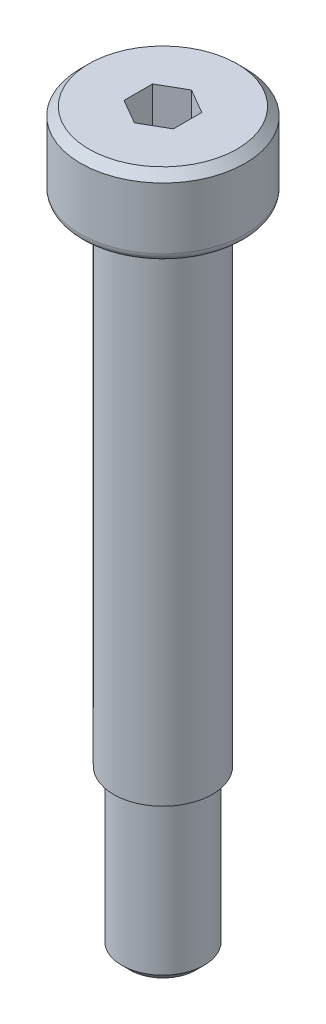
ISO-10303-21;
HEADER;
FILE_DESCRIPTION(('STEP AP214'),'2;1');
FILE_NAME('part.step','',(''),(''),'','','');
FILE_SCHEMA(('AUTOMOTIVE_DESIGN { 1 0 10303 214 1 1 1 1 }'));
ENDSEC;
DATA;
#1=APPLICATION_CONTEXT('core data for automotive mechanical design processes');
#2=APPLICATION_PROTOCOL_DEFINITION('international standard','automotive_design',2000,#1);
#3=PRODUCT_CONTEXT('',#1,'mechanical');
#4=PRODUCT('Part','Part','',(#3));
#5=PRODUCT_RELATED_PRODUCT_CATEGORY('part','',(#4));
#6=PRODUCT_DEFINITION_FORMATION('','',#4);
#7=PRODUCT_DEFINITION_CONTEXT('part definition',#1,'design');
#8=PRODUCT_DEFINITION('design','',#6,#7);
#9=PRODUCT_DEFINITION_SHAPE('','',#8);
#10=(LENGTH_UNIT() NAMED_UNIT(*) SI_UNIT(.MILLI.,.METRE.));
#11=(NAMED_UNIT(*) PLANE_ANGLE_UNIT() SI_UNIT($,.RADIAN.));
#12=(NAMED_UNIT(*) SI_UNIT($,.STERADIAN.) SOLID_ANGLE_UNIT());
#13=UNCERTAINTY_MEASURE_WITH_UNIT(LENGTH_MEASURE(1.E-05),#10,'distance_accuracy_value','');
#14=(GEOMETRIC_REPRESENTATION_CONTEXT(3) GLOBAL_UNCERTAINTY_ASSIGNED_CONTEXT((#13)) GLOBAL_UNIT_ASSIGNED_CONTEXT((#10,
#11,#12)) REPRESENTATION_CONTEXT('',''));
#15=CARTESIAN_POINT('',(0.,0.,0.));
#16=DIRECTION('',(0.,0.,1.));
#17=DIRECTION('',(1.,0.,0.));
#18=AXIS2_PLACEMENT_3D('',#15,#16,#17);
#19=CARTESIAN_POINT('',(0.,0.,0.));
#20=DIRECTION('',(0.,-1.,0.));
#21=DIRECTION('',(1.,0.,0.));
#22=AXIS2_PLACEMENT_3D('',#19,#20,#21);
#23=PLANE('',#22);
#24=CARTESIAN_POINT('',(0.,0.,0.));
#25=DIRECTION('',(0.,-1.,0.));
#26=DIRECTION('',(1.,0.,0.));
#27=AXIS2_PLACEMENT_3D('',#24,#25,#26);
#28=CIRCLE('',#27,4.49999999999999);
#29=CARTESIAN_POINT('',(4.49999999999999,0.,0.));
#30=VERTEX_POINT('',#29);
#31=EDGE_CURVE('E191',#30,#30,#28,.F.);
#32=ORIENTED_EDGE('',*,*,#31,.T.);
#33=EDGE_LOOP('',(#32));
#34=FACE_BOUND('',#33,.T.);
#35=DIRECTION('',(0.866025403784438,0.,-0.5));
#36=VECTOR('',#35,1.);
#37=CARTESIAN_POINT('',(0.,0.,1.73205080756888));
#38=LINE('',#37,#36);
#39=CARTESIAN_POINT('',(0.,0.,1.73205080756888));
#40=VERTEX_POINT('',#39);
#41=CARTESIAN_POINT('',(1.5,0.,0.866025403784439));
#42=VERTEX_POINT('',#41);
#43=EDGE_CURVE('E143',#40,#42,#38,.T.);
#44=ORIENTED_EDGE('',*,*,#43,.F.);
#45=DIRECTION('',(0.866025403784438,0.,0.5));
#46=VECTOR('',#45,1.);
#47=CARTESIAN_POINT('',(-1.5,0.,0.866025403784439));
#48=LINE('',#47,#46);
#49=CARTESIAN_POINT('',(-1.5,0.,0.866025403784439));
#50=VERTEX_POINT('',#49);
#51=EDGE_CURVE('E62',#50,#40,#48,.T.);
#52=ORIENTED_EDGE('',*,*,#51,.F.);
#53=DIRECTION('',(0.,0.,1.));
#54=VECTOR('',#53,1.);
#55=CARTESIAN_POINT('',(-1.5,0.,-0.866025403784439));
#56=LINE('',#55,#54);
#57=CARTESIAN_POINT('',(-1.5,0.,-0.866025403784439));
#58=VERTEX_POINT('',#57);
#59=EDGE_CURVE('E156',#58,#50,#56,.T.);
#60=ORIENTED_EDGE('',*,*,#59,.F.);
#61=DIRECTION('',(-0.866025403784439,0.,0.5));
#62=VECTOR('',#61,1.);
#63=CARTESIAN_POINT('',(0.,0.,-1.73205080756888));
#64=LINE('',#63,#62);
#65=CARTESIAN_POINT('',(0.,0.,-1.73205080756888));
#66=VERTEX_POINT('',#65);
#67=EDGE_CURVE('E153',#66,#58,#64,.T.);
#68=ORIENTED_EDGE('',*,*,#67,.F.);
#69=DIRECTION('',(-0.866025403784439,0.,-0.5));
#70=VECTOR('',#69,1.);
#71=CARTESIAN_POINT('',(1.5,0.,-0.86602540378444));
#72=LINE('',#71,#70);
#73=CARTESIAN_POINT('',(1.5,0.,-0.86602540378444));
#74=VERTEX_POINT('',#73);
#75=EDGE_CURVE('E110',#74,#66,#72,.T.);
#76=ORIENTED_EDGE('',*,*,#75,.F.);
#77=DIRECTION('',(0.,0.,-1.));
#78=VECTOR('',#77,1.);
#79=CARTESIAN_POINT('',(1.5,0.,0.866025403784439));
#80=LINE('',#79,#78);
#81=EDGE_CURVE('E147',#42,#74,#80,.T.);
#82=ORIENTED_EDGE('',*,*,#81,.F.);
#83=EDGE_LOOP('',(#44,#52,#60,#68,#76,#82));
#84=FACE_BOUND('',#83,.T.);
#85=ADVANCED_FACE('F45',(#34,#84),#23,.F.);
#86=CARTESIAN_POINT('',(0.,5.,0.));
#87=DIRECTION('',(0.,1.,0.));
#88=DIRECTION('',(-1.,0.,0.));
#89=AXIS2_PLACEMENT_3D('',#86,#87,#88);
#90=CYLINDRICAL_SURFACE('',#89,5.);
#91=CARTESIAN_POINT('',(0.,-4.23,0.));
#92=DIRECTION('',(0.,1.,0.));
#93=DIRECTION('',(-1.,0.,0.));
#94=AXIS2_PLACEMENT_3D('',#91,#92,#93);
#95=CIRCLE('',#94,5.);
#96=CARTESIAN_POINT('',(-5.,-4.23,0.));
#97=VERTEX_POINT('',#96);
#98=EDGE_CURVE('E199',#97,#97,#95,.T.);
#99=ORIENTED_EDGE('',*,*,#98,.T.);
#100=EDGE_LOOP('',(#99));
#101=FACE_BOUND('',#100,.T.);
#102=CARTESIAN_POINT('',(0.,-0.500000000000005,0.));
#103=DIRECTION('',(0.,-1.,0.));
#104=DIRECTION('',(1.,0.,0.));
#105=AXIS2_PLACEMENT_3D('',#102,#103,#104);
#106=CIRCLE('',#105,5.);
#107=CARTESIAN_POINT('',(5.,-0.500000000000004,0.));
#108=VERTEX_POINT('',#107);
#109=EDGE_CURVE('E195',#108,#108,#106,.T.);
#110=ORIENTED_EDGE('',*,*,#109,.T.);
#111=EDGE_LOOP('',(#110));
#112=FACE_BOUND('',#111,.T.);
#113=ADVANCED_FACE('F225',(#101,#112),#90,.T.);
#114=CARTESIAN_POINT('',(5.,-4.73,0.));
#115=DIRECTION('',(0.,1.,0.));
#116=DIRECTION('',(-1.,0.,0.));
#117=AXIS2_PLACEMENT_3D('',#114,#115,#116);
#118=PLANE('',#117);
#119=CARTESIAN_POINT('',(0.,-4.73,0.));
#120=DIRECTION('',(0.,1.,0.));
#121=DIRECTION('',(-1.,0.,0.));
#122=AXIS2_PLACEMENT_3D('',#119,#120,#121);
#123=CIRCLE('',#122,4.5);
#124=CARTESIAN_POINT('',(-4.5,-4.73,0.));
#125=VERTEX_POINT('',#124);
#126=EDGE_CURVE('E203',#125,#125,#123,.F.);
#127=ORIENTED_EDGE('',*,*,#126,.T.);
#128=EDGE_LOOP('',(#127));
#129=FACE_BOUND('',#128,.T.);
#130=CARTESIAN_POINT('',(0.,-4.73,0.));
#131=DIRECTION('',(0.,1.,0.));
#132=DIRECTION('',(-1.,0.,0.));
#133=AXIS2_PLACEMENT_3D('',#130,#131,#132);
#134=CIRCLE('',#133,2.75);
#135=CARTESIAN_POINT('',(-2.75,-4.73,0.));
#136=VERTEX_POINT('',#135);
#137=EDGE_CURVE('E187',#136,#136,#134,.T.);
#138=ORIENTED_EDGE('',*,*,#137,.T.);
#139=EDGE_LOOP('',(#138));
#140=FACE_BOUND('',#139,.T.);
#141=ADVANCED_FACE('F233',(#129,#140),#118,.F.);
#142=CARTESIAN_POINT('',(0.,5.,0.));
#143=DIRECTION('',(0.,1.,0.));
#144=DIRECTION('',(-1.,0.,0.));
#145=AXIS2_PLACEMENT_3D('',#142,#143,#144);
#146=CYLINDRICAL_SURFACE('',#145,2.75);
#147=ORIENTED_EDGE('',*,*,#137,.F.);
#148=EDGE_LOOP('',(#147));
#149=FACE_BOUND('',#148,.T.);
#150=CARTESIAN_POINT('',(0.,-5.23,0.));
#151=DIRECTION('',(0.,1.,0.));
#152=DIRECTION('',(-1.,0.,0.));
#153=AXIS2_PLACEMENT_3D('',#150,#151,#152);
#154=CIRCLE('',#153,2.75);
#155=CARTESIAN_POINT('',(-2.75,-5.23,0.));
#156=VERTEX_POINT('',#155);
#157=EDGE_CURVE('E183',#156,#156,#154,.T.);
#158=ORIENTED_EDGE('',*,*,#157,.T.);
#159=EDGE_LOOP('',(#158));
#160=FACE_BOUND('',#159,.T.);
#161=ADVANCED_FACE('F287',(#149,#160),#146,.T.);
#162=CARTESIAN_POINT('',(2.75,-5.23,0.));
#163=DIRECTION('',(0.,-1.,0.));
#164=DIRECTION('',(1.,0.,0.));
#165=AXIS2_PLACEMENT_3D('',#162,#163,#164);
#166=PLANE('',#165);
#167=ORIENTED_EDGE('',*,*,#157,.F.);
#168=EDGE_LOOP('',(#167));
#169=FACE_BOUND('',#168,.T.);
#170=CARTESIAN_POINT('',(0.,-5.23,0.));
#171=DIRECTION('',(0.,1.,0.));
#172=DIRECTION('',(-1.,0.,0.));
#173=AXIS2_PLACEMENT_3D('',#170,#171,#172);
#174=CIRCLE('',#173,3.);
#175=CARTESIAN_POINT('',(-3.,-5.23,0.));
#176=VERTEX_POINT('',#175);
#177=EDGE_CURVE('E179',#176,#176,#174,.T.);
#178=ORIENTED_EDGE('',*,*,#177,.T.);
#179=EDGE_LOOP('',(#178));
#180=FACE_BOUND('',#179,.T.);
#181=ADVANCED_FACE('F283',(#169,#180),#166,.F.);
#182=CARTESIAN_POINT('',(0.,5.,0.));
#183=DIRECTION('',(0.,1.,0.));
#184=DIRECTION('',(-1.,0.,0.));
#185=AXIS2_PLACEMENT_3D('',#182,#183,#184);
#186=CYLINDRICAL_SURFACE('',#185,3.);
#187=ORIENTED_EDGE('',*,*,#177,.F.);
#188=EDGE_LOOP('',(#187));
#189=FACE_BOUND('',#188,.T.);
#190=CARTESIAN_POINT('',(0.,-34.73,0.));
#191=DIRECTION('',(0.,1.,0.));
#192=DIRECTION('',(-1.,0.,0.));
#193=AXIS2_PLACEMENT_3D('',#190,#191,#192);
#194=CIRCLE('',#193,3.00000000000001);
#195=CARTESIAN_POINT('',(-3.,-34.73,0.));
#196=VERTEX_POINT('',#195);
#197=EDGE_CURVE('E175',#196,#196,#194,.T.);
#198=ORIENTED_EDGE('',*,*,#197,.T.);
#199=EDGE_LOOP('',(#198));
#200=FACE_BOUND('',#199,.T.);
#201=ADVANCED_FACE('F279',(#189,#200),#186,.T.);
#202=CARTESIAN_POINT('',(3.00000000000001,-34.73,0.));
#203=DIRECTION('',(0.,1.,0.));
#204=DIRECTION('',(-1.,0.,0.));
#205=AXIS2_PLACEMENT_3D('',#202,#203,#204);
#206=PLANE('',#205);
#207=ORIENTED_EDGE('',*,*,#197,.F.);
#208=EDGE_LOOP('',(#207));
#209=FACE_BOUND('',#208,.T.);
#210=CARTESIAN_POINT('',(0.,-34.73,0.));
#211=DIRECTION('',(0.,1.,0.));
#212=DIRECTION('',(-1.,0.,0.));
#213=AXIS2_PLACEMENT_3D('',#210,#211,#212);
#214=CIRCLE('',#213,2.5);
#215=CARTESIAN_POINT('',(-2.49999999999999,-34.73,0.));
#216=VERTEX_POINT('',#215);
#217=EDGE_CURVE('E162',#216,#216,#214,.T.);
#218=ORIENTED_EDGE('',*,*,#217,.T.);
#219=EDGE_LOOP('',(#218));
#220=FACE_BOUND('',#219,.T.);
#221=ADVANCED_FACE('F276',(#209,#220),#206,.F.);
#222=CARTESIAN_POINT('',(0.,5.,0.));
#223=DIRECTION('',(0.,1.,0.));
#224=DIRECTION('',(-1.,0.,0.));
#225=AXIS2_PLACEMENT_3D('',#222,#223,#224);
#226=CYLINDRICAL_SURFACE('',#225,2.5);
#227=CARTESIAN_POINT('',(0.,-43.98,0.));
#228=DIRECTION('',(0.,1.,0.));
#229=DIRECTION('',(-1.,0.,0.));
#230=AXIS2_PLACEMENT_3D('',#227,#228,#229);
#231=CIRCLE('',#230,2.5);
#232=CARTESIAN_POINT('',(-2.49999999999999,-43.98,0.));
#233=VERTEX_POINT('',#232);
#234=EDGE_CURVE('E55',#233,#233,#231,.T.);
#235=ORIENTED_EDGE('',*,*,#234,.T.);
#236=EDGE_LOOP('',(#235));
#237=FACE_BOUND('',#236,.T.);
#238=ORIENTED_EDGE('',*,*,#217,.F.);
#239=EDGE_LOOP('',(#238));
#240=FACE_BOUND('',#239,.T.);
#241=ADVANCED_FACE('F211',(#237,#240),#226,.T.);
#242=CARTESIAN_POINT('',(2.50000000000001,-44.48,0.));
#243=DIRECTION('',(0.,1.,0.));
#244=DIRECTION('',(-1.,0.,0.));
#245=AXIS2_PLACEMENT_3D('',#242,#243,#244);
#246=PLANE('',#245);
#247=CARTESIAN_POINT('',(0.,-44.48,0.));
#248=DIRECTION('',(0.,1.,0.));
#249=DIRECTION('',(-1.,0.,0.));
#250=AXIS2_PLACEMENT_3D('',#247,#248,#249);
#251=CIRCLE('',#250,1.99999999999999);
#252=CARTESIAN_POINT('',(-1.99999999999998,-44.48,0.));
#253=VERTEX_POINT('',#252);
#254=EDGE_CURVE('E11',#253,#253,#251,.F.);
#255=ORIENTED_EDGE('',*,*,#254,.T.);
#256=EDGE_LOOP('',(#255));
#257=FACE_BOUND('',#256,.T.);
#258=ADVANCED_FACE('F271',(#257),#246,.F.);
#259=CARTESIAN_POINT('',(-1.5,-2.4,0.866025403784439));
#260=DIRECTION('',(-0.5,0.,0.866025403784439));
#261=DIRECTION('',(0.866025403784439,0.,0.5));
#262=AXIS2_PLACEMENT_3D('',#259,#260,#261);
#263=PLANE('',#262);
#264=ORIENTED_EDGE('',*,*,#51,.T.);
#265=DIRECTION('',(0.,1.,0.));
#266=VECTOR('',#265,1.);
#267=CARTESIAN_POINT('',(0.,-2.4,1.73205080756888));
#268=LINE('',#267,#266);
#269=CARTESIAN_POINT('',(0.,-2.4,1.73205080756888));
#270=VERTEX_POINT('',#269);
#271=EDGE_CURVE('E92',#270,#40,#268,.T.);
#272=ORIENTED_EDGE('',*,*,#271,.F.);
#273=DIRECTION('',(0.866025403784438,0.,0.5));
#274=VECTOR('',#273,1.);
#275=CARTESIAN_POINT('',(-1.5,-2.4,0.866025403784439));
#276=LINE('',#275,#274);
#277=CARTESIAN_POINT('',(-1.5,-2.4,0.866025403784439));
#278=VERTEX_POINT('',#277);
#279=EDGE_CURVE('E159',#278,#270,#276,.T.);
#280=ORIENTED_EDGE('',*,*,#279,.F.);
#281=DIRECTION('',(0.,1.,0.));
#282=VECTOR('',#281,1.);
#283=CARTESIAN_POINT('',(-1.5,-2.4,0.866025403784439));
#284=LINE('',#283,#282);
#285=EDGE_CURVE('E70',#278,#50,#284,.T.);
#286=ORIENTED_EDGE('',*,*,#285,.T.);
#287=EDGE_LOOP('',(#264,#272,#280,#286));
#288=FACE_BOUND('',#287,.T.);
#289=ADVANCED_FACE('F261',(#288),#263,.F.);
#290=CARTESIAN_POINT('',(-1.5,-2.4,-0.866025403784439));
#291=DIRECTION('',(-1.,0.,0.));
#292=DIRECTION('',(0.,0.,1.));
#293=AXIS2_PLACEMENT_3D('',#290,#291,#292);
#294=PLANE('',#293);
#295=ORIENTED_EDGE('',*,*,#59,.T.);
#296=ORIENTED_EDGE('',*,*,#285,.F.);
#297=DIRECTION('',(0.,0.,1.));
#298=VECTOR('',#297,1.);
#299=CARTESIAN_POINT('',(-1.5,-2.4,-0.866025403784439));
#300=LINE('',#299,#298);
#301=CARTESIAN_POINT('',(-1.5,-2.4,-0.866025403784439));
#302=VERTEX_POINT('',#301);
#303=EDGE_CURVE('E124',#302,#278,#300,.T.);
#304=ORIENTED_EDGE('',*,*,#303,.F.);
#305=DIRECTION('',(0.,1.,0.));
#306=VECTOR('',#305,1.);
#307=CARTESIAN_POINT('',(-1.5,-2.4,-0.866025403784439));
#308=LINE('',#307,#306);
#309=EDGE_CURVE('E115',#302,#58,#308,.T.);
#310=ORIENTED_EDGE('',*,*,#309,.T.);
#311=EDGE_LOOP('',(#295,#296,#304,#310));
#312=FACE_BOUND('',#311,.T.);
#313=ADVANCED_FACE('F258',(#312),#294,.F.);
#314=CARTESIAN_POINT('',(0.,-2.4,-1.73205080756888));
#315=DIRECTION('',(-0.5,0.,-0.866025403784439));
#316=DIRECTION('',(-0.866025403784439,0.,0.5));
#317=AXIS2_PLACEMENT_3D('',#314,#315,#316);
#318=PLANE('',#317);
#319=ORIENTED_EDGE('',*,*,#67,.T.);
#320=ORIENTED_EDGE('',*,*,#309,.F.);
#321=DIRECTION('',(-0.866025403784439,0.,0.5));
#322=VECTOR('',#321,1.);
#323=CARTESIAN_POINT('',(0.,-2.4,-1.73205080756888));
#324=LINE('',#323,#322);
#325=CARTESIAN_POINT('',(0.,-2.4,-1.73205080756888));
#326=VERTEX_POINT('',#325);
#327=EDGE_CURVE('E119',#326,#302,#324,.T.);
#328=ORIENTED_EDGE('',*,*,#327,.F.);
#329=DIRECTION('',(0.,1.,0.));
#330=VECTOR('',#329,1.);
#331=CARTESIAN_POINT('',(0.,-2.4,-1.73205080756888));
#332=LINE('',#331,#330);
#333=EDGE_CURVE('E103',#326,#66,#332,.T.);
#334=ORIENTED_EDGE('',*,*,#333,.T.);
#335=EDGE_LOOP('',(#319,#320,#328,#334));
#336=FACE_BOUND('',#335,.T.);
#337=ADVANCED_FACE('F120',(#336),#318,.F.);
#338=CARTESIAN_POINT('',(1.5,-2.4,-0.86602540378444));
#339=DIRECTION('',(0.5,0.,-0.866025403784439));
#340=DIRECTION('',(-0.866025403784439,0.,-0.5));
#341=AXIS2_PLACEMENT_3D('',#338,#339,#340);
#342=PLANE('',#341);
#343=ORIENTED_EDGE('',*,*,#75,.T.);
#344=ORIENTED_EDGE('',*,*,#333,.F.);
#345=DIRECTION('',(-0.866025403784439,0.,-0.5));
#346=VECTOR('',#345,1.);
#347=CARTESIAN_POINT('',(1.5,-2.4,-0.86602540378444));
#348=LINE('',#347,#346);
#349=CARTESIAN_POINT('',(1.5,-2.4,-0.86602540378444));
#350=VERTEX_POINT('',#349);
#351=EDGE_CURVE('E107',#350,#326,#348,.T.);
#352=ORIENTED_EDGE('',*,*,#351,.F.);
#353=DIRECTION('',(0.,1.,0.));
#354=VECTOR('',#353,1.);
#355=CARTESIAN_POINT('',(1.5,-2.4,-0.86602540378444));
#356=LINE('',#355,#354);
#357=EDGE_CURVE('E116',#350,#74,#356,.T.);
#358=ORIENTED_EDGE('',*,*,#357,.T.);
#359=EDGE_LOOP('',(#343,#344,#352,#358));
#360=FACE_BOUND('',#359,.T.);
#361=ADVANCED_FACE('F105',(#360),#342,.F.);
#362=CARTESIAN_POINT('',(1.5,-2.4,0.866025403784439));
#363=DIRECTION('',(1.,0.,0.));
#364=DIRECTION('',(0.,1.,0.));
#365=AXIS2_PLACEMENT_3D('',#362,#363,#364);
#366=PLANE('',#365);
#367=ORIENTED_EDGE('',*,*,#81,.T.);
#368=ORIENTED_EDGE('',*,*,#357,.F.);
#369=DIRECTION('',(0.,0.,-1.));
#370=VECTOR('',#369,1.);
#371=CARTESIAN_POINT('',(1.5,-2.4,0.866025403784439));
#372=LINE('',#371,#370);
#373=CARTESIAN_POINT('',(1.5,-2.4,0.866025403784439));
#374=VERTEX_POINT('',#373);
#375=EDGE_CURVE('E130',#374,#350,#372,.T.);
#376=ORIENTED_EDGE('',*,*,#375,.F.);
#377=DIRECTION('',(0.,1.,0.));
#378=VECTOR('',#377,1.);
#379=CARTESIAN_POINT('',(1.5,-2.4,0.866025403784439));
#380=LINE('',#379,#378);
#381=EDGE_CURVE('E167',#374,#42,#380,.T.);
#382=ORIENTED_EDGE('',*,*,#381,.T.);
#383=EDGE_LOOP('',(#367,#368,#376,#382));
#384=FACE_BOUND('',#383,.T.);
#385=ADVANCED_FACE('F254',(#384),#366,.F.);
#386=CARTESIAN_POINT('',(0.,-2.4,1.73205080756888));
#387=DIRECTION('',(0.5,0.,0.866025403784438));
#388=DIRECTION('',(0.866025403784439,0.,-0.5));
#389=AXIS2_PLACEMENT_3D('',#386,#387,#388);
#390=PLANE('',#389);
#391=ORIENTED_EDGE('',*,*,#43,.T.);
#392=ORIENTED_EDGE('',*,*,#381,.F.);
#393=DIRECTION('',(0.866025403784438,0.,-0.5));
#394=VECTOR('',#393,1.);
#395=CARTESIAN_POINT('',(0.,-2.4,1.73205080756888));
#396=LINE('',#395,#394);
#397=EDGE_CURVE('E135',#270,#374,#396,.T.);
#398=ORIENTED_EDGE('',*,*,#397,.F.);
#399=ORIENTED_EDGE('',*,*,#271,.T.);
#400=EDGE_LOOP('',(#391,#392,#398,#399));
#401=FACE_BOUND('',#400,.T.);
#402=ADVANCED_FACE('F245',(#401),#390,.F.);
#403=CARTESIAN_POINT('',(0.,-2.4,0.));
#404=DIRECTION('',(0.,1.,0.));
#405=DIRECTION('',(-1.,0.,0.));
#406=AXIS2_PLACEMENT_3D('',#403,#404,#405);
#407=PLANE('',#406);
#408=ORIENTED_EDGE('',*,*,#279,.T.);
#409=ORIENTED_EDGE('',*,*,#397,.T.);
#410=ORIENTED_EDGE('',*,*,#375,.T.);
#411=ORIENTED_EDGE('',*,*,#351,.T.);
#412=ORIENTED_EDGE('',*,*,#327,.T.);
#413=ORIENTED_EDGE('',*,*,#303,.T.);
#414=EDGE_LOOP('',(#408,#409,#410,#411,#412,#413));
#415=FACE_BOUND('',#414,.T.);
#416=ADVANCED_FACE('F127',(#415),#407,.T.);
#417=CARTESIAN_POINT('',(0.,0.,0.));
#418=DIRECTION('',(0.,-1.,0.));
#419=DIRECTION('',(1.,0.,0.));
#420=AXIS2_PLACEMENT_3D('',#417,#418,#419);
#421=CONICAL_SURFACE('',#420,4.49999999999999,0.785398163397452);
#422=ORIENTED_EDGE('',*,*,#109,.F.);
#423=EDGE_LOOP('',(#422));
#424=FACE_BOUND('',#423,.T.);
#425=ORIENTED_EDGE('',*,*,#31,.F.);
#426=EDGE_LOOP('',(#425));
#427=FACE_BOUND('',#426,.T.);
#428=ADVANCED_FACE('F221',(#424,#427),#421,.T.);
#429=CARTESIAN_POINT('',(0.,-4.23,0.));
#430=DIRECTION('',(0.,1.,0.));
#431=DIRECTION('',(-1.,0.,0.));
#432=AXIS2_PLACEMENT_3D('',#429,#430,#431);
#433=TOROIDAL_SURFACE('',#432,4.5,0.5);
#434=ORIENTED_EDGE('',*,*,#126,.F.);
#435=EDGE_LOOP('',(#434));
#436=FACE_BOUND('',#435,.T.);
#437=ORIENTED_EDGE('',*,*,#98,.F.);
#438=EDGE_LOOP('',(#437));
#439=FACE_BOUND('',#438,.T.);
#440=ADVANCED_FACE('F215',(#436,#439),#433,.T.);
#441=CARTESIAN_POINT('',(0.,-43.98,0.));
#442=DIRECTION('',(0.,1.,0.));
#443=DIRECTION('',(-1.,0.,0.));
#444=AXIS2_PLACEMENT_3D('',#441,#442,#443);
#445=CONICAL_SURFACE('',#444,2.5,0.785398163397447);
#446=ORIENTED_EDGE('',*,*,#254,.F.);
#447=EDGE_LOOP('',(#446));
#448=FACE_BOUND('',#447,.T.);
#449=ORIENTED_EDGE('',*,*,#234,.F.);
#450=EDGE_LOOP('',(#449));
#451=FACE_BOUND('',#450,.T.);
#452=ADVANCED_FACE('F48',(#448,#451),#445,.T.);
#453=CLOSED_SHELL('',(#85,#113,#141,#161,#181,#201,#221,#241,#258,#289,#313,#337,#361,#385,#402,
#416,#428,#440,#452));
#454=MANIFOLD_SOLID_BREP('B2',#453);
#455=ADVANCED_BREP_SHAPE_REPRESENTATION('',(#18,#454),#14);
#456=SHAPE_DEFINITION_REPRESENTATION(#9,#455);
ENDSEC;
END-ISO-10303-21;
